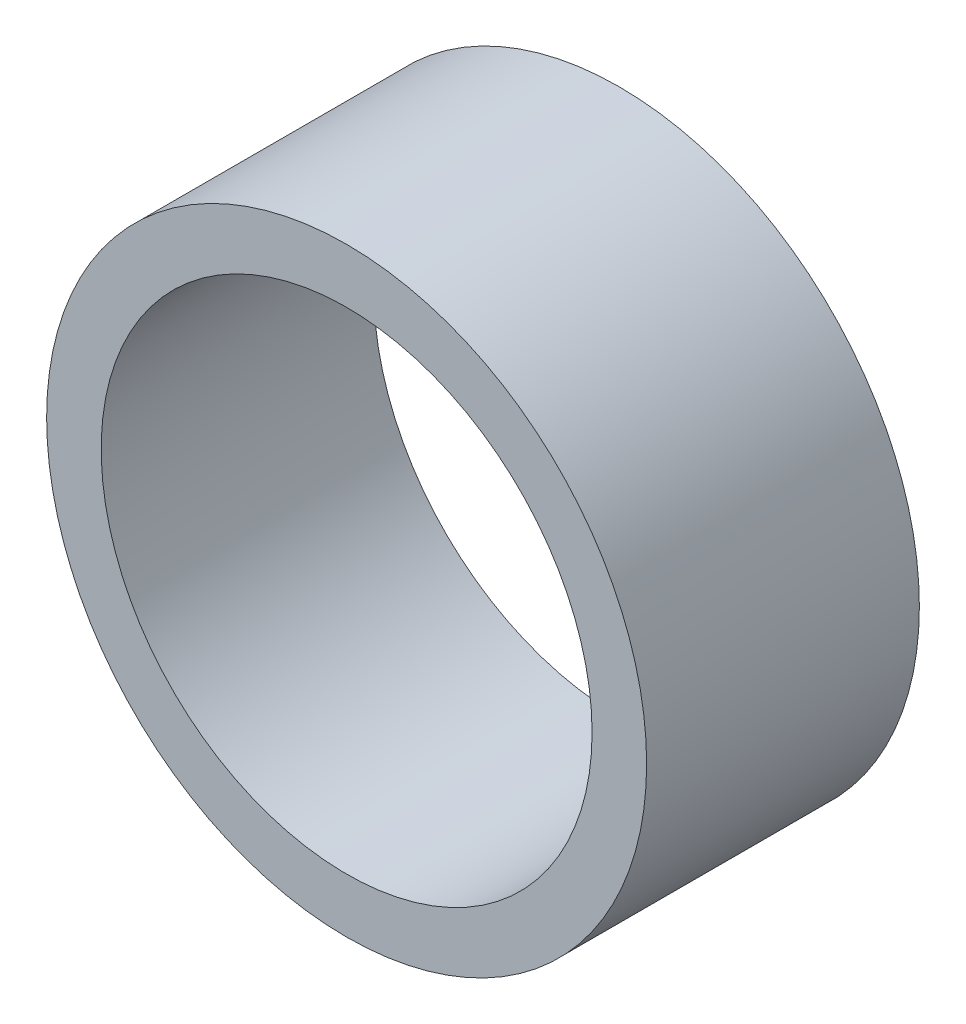
ISO-10303-21;
HEADER;
FILE_DESCRIPTION(('STEP AP214'),'2;1');
FILE_NAME('part.step','',(''),(''),'','','');
FILE_SCHEMA(('AUTOMOTIVE_DESIGN { 1 0 10303 214 1 1 1 1 }'));
ENDSEC;
DATA;
#1=APPLICATION_CONTEXT('core data for automotive mechanical design processes');
#2=APPLICATION_PROTOCOL_DEFINITION('international standard','automotive_design',2000,#1);
#3=PRODUCT_CONTEXT('',#1,'mechanical');
#4=PRODUCT('Part','Part','',(#3));
#5=PRODUCT_RELATED_PRODUCT_CATEGORY('part','',(#4));
#6=PRODUCT_DEFINITION_FORMATION('','',#4);
#7=PRODUCT_DEFINITION_CONTEXT('part definition',#1,'design');
#8=PRODUCT_DEFINITION('design','',#6,#7);
#9=PRODUCT_DEFINITION_SHAPE('','',#8);
#10=(LENGTH_UNIT() NAMED_UNIT(*) SI_UNIT(.MILLI.,.METRE.));
#11=(NAMED_UNIT(*) PLANE_ANGLE_UNIT() SI_UNIT($,.RADIAN.));
#12=(NAMED_UNIT(*) SI_UNIT($,.STERADIAN.) SOLID_ANGLE_UNIT());
#13=UNCERTAINTY_MEASURE_WITH_UNIT(LENGTH_MEASURE(1.E-05),#10,'distance_accuracy_value','');
#14=(GEOMETRIC_REPRESENTATION_CONTEXT(3) GLOBAL_UNCERTAINTY_ASSIGNED_CONTEXT((#13)) GLOBAL_UNIT_ASSIGNED_CONTEXT((#10,
#11,#12)) REPRESENTATION_CONTEXT('',''));
#15=CARTESIAN_POINT('',(0.,0.,0.));
#16=DIRECTION('',(0.,0.,1.));
#17=DIRECTION('',(1.,0.,0.));
#18=AXIS2_PLACEMENT_3D('',#15,#16,#17);
#19=CARTESIAN_POINT('',(0.,0.,5.));
#20=DIRECTION('',(0.,0.,1.));
#21=DIRECTION('',(1.,0.,0.));
#22=AXIS2_PLACEMENT_3D('',#19,#20,#21);
#23=PLANE('',#22);
#24=CARTESIAN_POINT('',(0.,0.,5.));
#25=DIRECTION('',(0.,0.,1.));
#26=DIRECTION('',(1.,0.,0.));
#27=AXIS2_PLACEMENT_3D('',#24,#25,#26);
#28=CIRCLE('',#27,5.5);
#29=CARTESIAN_POINT('',(5.5,0.,5.));
#30=VERTEX_POINT('',#29);
#31=EDGE_CURVE('E10',#30,#30,#28,.T.);
#32=ORIENTED_EDGE('',*,*,#31,.T.);
#33=EDGE_LOOP('',(#32));
#34=FACE_BOUND('',#33,.T.);
#35=CARTESIAN_POINT('',(0.,0.,5.));
#36=DIRECTION('',(0.,0.,1.));
#37=DIRECTION('',(1.,0.,0.));
#38=AXIS2_PLACEMENT_3D('',#35,#36,#37);
#39=CIRCLE('',#38,4.5);
#40=CARTESIAN_POINT('',(4.5,0.,5.));
#41=VERTEX_POINT('',#40);
#42=EDGE_CURVE('E44',#41,#41,#39,.T.);
#43=ORIENTED_EDGE('',*,*,#42,.F.);
#44=EDGE_LOOP('',(#43));
#45=FACE_BOUND('',#44,.T.);
#46=ADVANCED_FACE('F33',(#34,#45),#23,.T.);
#47=CARTESIAN_POINT('',(0.,0.,0.));
#48=DIRECTION('',(0.,0.,1.));
#49=DIRECTION('',(1.,0.,0.));
#50=AXIS2_PLACEMENT_3D('',#47,#48,#49);
#51=PLANE('',#50);
#52=CARTESIAN_POINT('',(0.,0.,0.));
#53=DIRECTION('',(0.,0.,1.));
#54=DIRECTION('',(1.,0.,0.));
#55=AXIS2_PLACEMENT_3D('',#52,#53,#54);
#56=CIRCLE('',#55,5.5);
#57=CARTESIAN_POINT('',(5.5,0.,0.));
#58=VERTEX_POINT('',#57);
#59=EDGE_CURVE('E37',#58,#58,#56,.T.);
#60=ORIENTED_EDGE('',*,*,#59,.F.);
#61=EDGE_LOOP('',(#60));
#62=FACE_BOUND('',#61,.T.);
#63=CARTESIAN_POINT('',(0.,0.,0.));
#64=DIRECTION('',(0.,0.,1.));
#65=DIRECTION('',(1.,0.,0.));
#66=AXIS2_PLACEMENT_3D('',#63,#64,#65);
#67=CIRCLE('',#66,4.5);
#68=CARTESIAN_POINT('',(4.5,0.,0.));
#69=VERTEX_POINT('',#68);
#70=EDGE_CURVE('E46',#69,#69,#67,.T.);
#71=ORIENTED_EDGE('',*,*,#70,.T.);
#72=EDGE_LOOP('',(#71));
#73=FACE_BOUND('',#72,.T.);
#74=ADVANCED_FACE('F56',(#62,#73),#51,.F.);
#75=CARTESIAN_POINT('',(0.,0.,5.));
#76=DIRECTION('',(0.,0.,-1.));
#77=DIRECTION('',(-1.,0.,0.));
#78=AXIS2_PLACEMENT_3D('',#75,#76,#77);
#79=CYLINDRICAL_SURFACE('',#78,5.5);
#80=ORIENTED_EDGE('',*,*,#31,.F.);
#81=EDGE_LOOP('',(#80));
#82=FACE_BOUND('',#81,.T.);
#83=ORIENTED_EDGE('',*,*,#59,.T.);
#84=EDGE_LOOP('',(#83));
#85=FACE_BOUND('',#84,.T.);
#86=ADVANCED_FACE('F35',(#82,#85),#79,.T.);
#87=CARTESIAN_POINT('',(0.,0.,5.));
#88=DIRECTION('',(0.,0.,-1.));
#89=DIRECTION('',(-1.,0.,0.));
#90=AXIS2_PLACEMENT_3D('',#87,#88,#89);
#91=CYLINDRICAL_SURFACE('',#90,4.5);
#92=ORIENTED_EDGE('',*,*,#42,.T.);
#93=EDGE_LOOP('',(#92));
#94=FACE_BOUND('',#93,.T.);
#95=ORIENTED_EDGE('',*,*,#70,.F.);
#96=EDGE_LOOP('',(#95));
#97=FACE_BOUND('',#96,.T.);
#98=ADVANCED_FACE('F52',(#94,#97),#91,.F.);
#99=CLOSED_SHELL('',(#46,#74,#86,#98));
#100=MANIFOLD_SOLID_BREP('B2',#99);
#101=ADVANCED_BREP_SHAPE_REPRESENTATION('',(#18,#100),#14);
#102=SHAPE_DEFINITION_REPRESENTATION(#9,#101);
ENDSEC;
END-ISO-10303-21;
